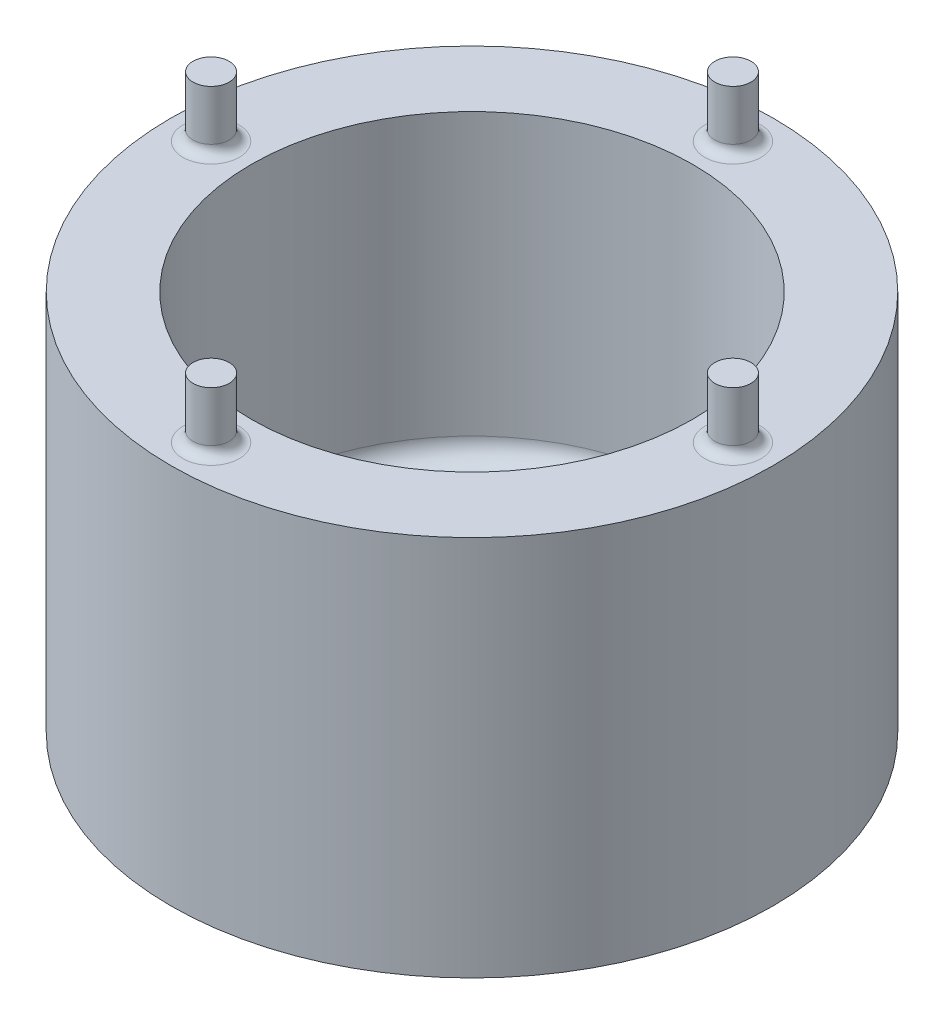
ISO-10303-21;
HEADER;
FILE_DESCRIPTION(('STEP AP214'),'2;1');
FILE_NAME('part.step','',(''),(''),'','','');
FILE_SCHEMA(('AUTOMOTIVE_DESIGN { 1 0 10303 214 1 1 1 1 }'));
ENDSEC;
DATA;
#1=APPLICATION_CONTEXT('core data for automotive mechanical design processes');
#2=APPLICATION_PROTOCOL_DEFINITION('international standard','automotive_design',2000,#1);
#3=PRODUCT_CONTEXT('',#1,'mechanical');
#4=PRODUCT('Part','Part','',(#3));
#5=PRODUCT_RELATED_PRODUCT_CATEGORY('part','',(#4));
#6=PRODUCT_DEFINITION_FORMATION('','',#4);
#7=PRODUCT_DEFINITION_CONTEXT('part definition',#1,'design');
#8=PRODUCT_DEFINITION('design','',#6,#7);
#9=PRODUCT_DEFINITION_SHAPE('','',#8);
#10=(LENGTH_UNIT() NAMED_UNIT(*) SI_UNIT(.MILLI.,.METRE.));
#11=(NAMED_UNIT(*) PLANE_ANGLE_UNIT() SI_UNIT($,.RADIAN.));
#12=(NAMED_UNIT(*) SI_UNIT($,.STERADIAN.) SOLID_ANGLE_UNIT());
#13=UNCERTAINTY_MEASURE_WITH_UNIT(LENGTH_MEASURE(1.E-05),#10,'distance_accuracy_value','');
#14=(GEOMETRIC_REPRESENTATION_CONTEXT(3) GLOBAL_UNCERTAINTY_ASSIGNED_CONTEXT((#13)) GLOBAL_UNIT_ASSIGNED_CONTEXT((#10,
#11,#12)) REPRESENTATION_CONTEXT('',''));
#15=CARTESIAN_POINT('',(0.,0.,0.));
#16=DIRECTION('',(0.,0.,1.));
#17=DIRECTION('',(1.,0.,0.));
#18=AXIS2_PLACEMENT_3D('',#15,#16,#17);
#19=CARTESIAN_POINT('',(0.,4.,0.));
#20=DIRECTION('',(0.,-1.,0.));
#21=DIRECTION('',(0.,0.,-1.));
#22=AXIS2_PLACEMENT_3D('',#19,#20,#21);
#23=CYLINDRICAL_SURFACE('',#22,15.);
#24=CARTESIAN_POINT('',(0.,0.,0.));
#25=DIRECTION('',(0.,1.,0.));
#26=DIRECTION('',(0.,0.,1.));
#27=AXIS2_PLACEMENT_3D('',#24,#25,#26);
#28=CIRCLE('',#27,15.);
#29=CARTESIAN_POINT('',(0.,0.,15.));
#30=VERTEX_POINT('',#29);
#31=EDGE_CURVE('E69',#30,#30,#28,.T.);
#32=ORIENTED_EDGE('',*,*,#31,.T.);
#33=EDGE_LOOP('',(#32));
#34=FACE_BOUND('',#33,.T.);
#35=CARTESIAN_POINT('',(0.,19.,0.));
#36=DIRECTION('',(0.,1.,0.));
#37=DIRECTION('',(0.,0.,1.));
#38=AXIS2_PLACEMENT_3D('',#35,#36,#37);
#39=CIRCLE('',#38,15.);
#40=CARTESIAN_POINT('',(0.,19.,15.));
#41=VERTEX_POINT('',#40);
#42=EDGE_CURVE('E72',#41,#41,#39,.T.);
#43=ORIENTED_EDGE('',*,*,#42,.F.);
#44=EDGE_LOOP('',(#43));
#45=FACE_BOUND('',#44,.T.);
#46=ADVANCED_FACE('F31',(#34,#45),#23,.T.);
#47=CARTESIAN_POINT('',(0.,0.,0.));
#48=DIRECTION('',(0.,1.,0.));
#49=DIRECTION('',(0.,0.,1.));
#50=AXIS2_PLACEMENT_3D('',#47,#48,#49);
#51=PLANE('',#50);
#52=ORIENTED_EDGE('',*,*,#31,.F.);
#53=EDGE_LOOP('',(#52));
#54=FACE_BOUND('',#53,.T.);
#55=ADVANCED_FACE('F108',(#54),#51,.F.);
#56=CARTESIAN_POINT('',(0.,19.,0.));
#57=DIRECTION('',(0.,1.,0.));
#58=DIRECTION('',(0.,0.,1.));
#59=AXIS2_PLACEMENT_3D('',#56,#57,#58);
#60=PLANE('',#59);
#61=CARTESIAN_POINT('',(-13.,19.,1.36167772214882E-13));
#62=DIRECTION('',(0.,1.,0.));
#63=DIRECTION('',(0.,0.,1.));
#64=AXIS2_PLACEMENT_3D('',#61,#62,#63);
#65=CIRCLE('',#64,1.4);
#66=CARTESIAN_POINT('',(-13.,19.,1.40000000000014));
#67=VERTEX_POINT('',#66);
#68=EDGE_CURVE('E42',#67,#67,#65,.F.);
#69=ORIENTED_EDGE('',*,*,#68,.T.);
#70=EDGE_LOOP('',(#69));
#71=FACE_BOUND('',#70,.T.);
#72=CARTESIAN_POINT('',(0.,19.,-13.));
#73=DIRECTION('',(0.,1.,0.));
#74=DIRECTION('',(0.,0.,1.));
#75=AXIS2_PLACEMENT_3D('',#72,#73,#74);
#76=CIRCLE('',#75,1.4);
#77=CARTESIAN_POINT('',(0.,19.,-11.6));
#78=VERTEX_POINT('',#77);
#79=EDGE_CURVE('E51',#78,#78,#76,.F.);
#80=ORIENTED_EDGE('',*,*,#79,.T.);
#81=EDGE_LOOP('',(#80));
#82=FACE_BOUND('',#81,.T.);
#83=CARTESIAN_POINT('',(13.,19.,0.));
#84=DIRECTION('',(0.,1.,0.));
#85=DIRECTION('',(0.,0.,1.));
#86=AXIS2_PLACEMENT_3D('',#83,#84,#85);
#87=CIRCLE('',#86,1.4);
#88=CARTESIAN_POINT('',(13.,19.,1.39999999999995));
#89=VERTEX_POINT('',#88);
#90=EDGE_CURVE('E57',#89,#89,#87,.F.);
#91=ORIENTED_EDGE('',*,*,#90,.T.);
#92=EDGE_LOOP('',(#91));
#93=FACE_BOUND('',#92,.T.);
#94=CARTESIAN_POINT('',(0.,19.,13.));
#95=DIRECTION('',(0.,1.,0.));
#96=DIRECTION('',(0.,0.,1.));
#97=AXIS2_PLACEMENT_3D('',#94,#95,#96);
#98=CIRCLE('',#97,1.4);
#99=CARTESIAN_POINT('',(0.,19.,14.4));
#100=VERTEX_POINT('',#99);
#101=EDGE_CURVE('E63',#100,#100,#98,.F.);
#102=ORIENTED_EDGE('',*,*,#101,.T.);
#103=EDGE_LOOP('',(#102));
#104=FACE_BOUND('',#103,.T.);
#105=ORIENTED_EDGE('',*,*,#42,.T.);
#106=EDGE_LOOP('',(#105));
#107=FACE_BOUND('',#106,.T.);
#108=CARTESIAN_POINT('',(0.,19.,0.));
#109=DIRECTION('',(0.,1.,0.));
#110=DIRECTION('',(0.,0.,1.));
#111=AXIS2_PLACEMENT_3D('',#108,#109,#110);
#112=CIRCLE('',#111,11.);
#113=CARTESIAN_POINT('',(0.,19.,11.));
#114=VERTEX_POINT('',#113);
#115=EDGE_CURVE('E75',#114,#114,#112,.T.);
#116=ORIENTED_EDGE('',*,*,#115,.F.);
#117=EDGE_LOOP('',(#116));
#118=FACE_BOUND('',#117,.T.);
#119=ADVANCED_FACE('F114',(#71,#82,#93,#104,#107,#118),#60,.T.);
#120=CARTESIAN_POINT('',(0.,19.,0.));
#121=DIRECTION('',(0.,-1.,0.));
#122=DIRECTION('',(0.,0.,-1.));
#123=AXIS2_PLACEMENT_3D('',#120,#121,#122);
#124=CYLINDRICAL_SURFACE('',#123,11.);
#125=CARTESIAN_POINT('',(0.,5.,0.));
#126=DIRECTION('',(0.,1.,0.));
#127=DIRECTION('',(0.,0.,1.));
#128=AXIS2_PLACEMENT_3D('',#125,#126,#127);
#129=CIRCLE('',#128,11.);
#130=CARTESIAN_POINT('',(0.,5.,11.));
#131=VERTEX_POINT('',#130);
#132=EDGE_CURVE('E38',#131,#131,#129,.F.);
#133=ORIENTED_EDGE('',*,*,#132,.T.);
#134=EDGE_LOOP('',(#133));
#135=FACE_BOUND('',#134,.T.);
#136=ORIENTED_EDGE('',*,*,#115,.T.);
#137=EDGE_LOOP('',(#136));
#138=FACE_BOUND('',#137,.T.);
#139=ADVANCED_FACE('F145',(#135,#138),#124,.F.);
#140=CARTESIAN_POINT('',(0.,4.,0.));
#141=DIRECTION('',(0.,1.,0.));
#142=DIRECTION('',(0.,0.,1.));
#143=AXIS2_PLACEMENT_3D('',#140,#141,#142);
#144=PLANE('',#143);
#145=CARTESIAN_POINT('',(0.,4.,0.));
#146=DIRECTION('',(0.,1.,0.));
#147=DIRECTION('',(0.,0.,1.));
#148=AXIS2_PLACEMENT_3D('',#145,#146,#147);
#149=CIRCLE('',#148,10.);
#150=CARTESIAN_POINT('',(0.,4.,10.));
#151=VERTEX_POINT('',#150);
#152=EDGE_CURVE('E10',#151,#151,#149,.T.);
#153=ORIENTED_EDGE('',*,*,#152,.T.);
#154=EDGE_LOOP('',(#153));
#155=FACE_BOUND('',#154,.T.);
#156=ADVANCED_FACE('F158',(#155),#144,.T.);
#157=CARTESIAN_POINT('',(0.,22.,13.));
#158=DIRECTION('',(0.,-1.,0.));
#159=DIRECTION('',(0.,0.,-1.));
#160=AXIS2_PLACEMENT_3D('',#157,#158,#159);
#161=CYLINDRICAL_SURFACE('',#160,0.9);
#162=CARTESIAN_POINT('',(0.,19.5,13.));
#163=DIRECTION('',(0.,1.,0.));
#164=DIRECTION('',(0.,0.,1.));
#165=AXIS2_PLACEMENT_3D('',#162,#163,#164);
#166=CIRCLE('',#165,0.9);
#167=CARTESIAN_POINT('',(0.,19.5,13.9));
#168=VERTEX_POINT('',#167);
#169=EDGE_CURVE('E66',#168,#168,#166,.T.);
#170=ORIENTED_EDGE('',*,*,#169,.T.);
#171=EDGE_LOOP('',(#170));
#172=FACE_BOUND('',#171,.T.);
#173=CARTESIAN_POINT('',(0.,22.,13.));
#174=DIRECTION('',(0.,1.,0.));
#175=DIRECTION('',(0.,0.,1.));
#176=AXIS2_PLACEMENT_3D('',#173,#174,#175);
#177=CIRCLE('',#176,0.9);
#178=CARTESIAN_POINT('',(0.,22.,13.9));
#179=VERTEX_POINT('',#178);
#180=EDGE_CURVE('E78',#179,#179,#177,.T.);
#181=ORIENTED_EDGE('',*,*,#180,.F.);
#182=EDGE_LOOP('',(#181));
#183=FACE_BOUND('',#182,.T.);
#184=ADVANCED_FACE('F163',(#172,#183),#161,.T.);
#185=CARTESIAN_POINT('',(0.,22.,13.));
#186=DIRECTION('',(0.,1.,0.));
#187=DIRECTION('',(0.,0.,1.));
#188=AXIS2_PLACEMENT_3D('',#185,#186,#187);
#189=PLANE('',#188);
#190=ORIENTED_EDGE('',*,*,#180,.T.);
#191=EDGE_LOOP('',(#190));
#192=FACE_BOUND('',#191,.T.);
#193=ADVANCED_FACE('F124',(#192),#189,.T.);
#194=CARTESIAN_POINT('',(0.,19.5,13.));
#195=DIRECTION('',(0.,1.,0.));
#196=DIRECTION('',(0.,0.,1.));
#197=AXIS2_PLACEMENT_3D('',#194,#195,#196);
#198=TOROIDAL_SURFACE('',#197,1.4,0.5);
#199=ORIENTED_EDGE('',*,*,#101,.F.);
#200=EDGE_LOOP('',(#199));
#201=FACE_BOUND('',#200,.T.);
#202=ORIENTED_EDGE('',*,*,#169,.F.);
#203=EDGE_LOOP('',(#202));
#204=FACE_BOUND('',#203,.T.);
#205=ADVANCED_FACE('F120',(#201,#204),#198,.F.);
#206=CARTESIAN_POINT('',(13.,22.,0.));
#207=DIRECTION('',(0.,-1.,0.));
#208=DIRECTION('',(0.,0.,-1.));
#209=AXIS2_PLACEMENT_3D('',#206,#207,#208);
#210=CYLINDRICAL_SURFACE('',#209,0.9);
#211=CARTESIAN_POINT('',(13.,19.5,0.));
#212=DIRECTION('',(0.,1.,0.));
#213=DIRECTION('',(0.,0.,1.));
#214=AXIS2_PLACEMENT_3D('',#211,#212,#213);
#215=CIRCLE('',#214,0.9);
#216=CARTESIAN_POINT('',(13.,19.5,0.899999999999954));
#217=VERTEX_POINT('',#216);
#218=EDGE_CURVE('E60',#217,#217,#215,.T.);
#219=ORIENTED_EDGE('',*,*,#218,.T.);
#220=EDGE_LOOP('',(#219));
#221=FACE_BOUND('',#220,.T.);
#222=CARTESIAN_POINT('',(13.,22.,0.));
#223=DIRECTION('',(0.,1.,0.));
#224=DIRECTION('',(1.,0.,0.));
#225=AXIS2_PLACEMENT_3D('',#222,#223,#224);
#226=CIRCLE('',#225,0.9);
#227=CARTESIAN_POINT('',(13.9,22.,0.));
#228=VERTEX_POINT('',#227);
#229=EDGE_CURVE('E81',#228,#228,#226,.T.);
#230=ORIENTED_EDGE('',*,*,#229,.F.);
#231=EDGE_LOOP('',(#230));
#232=FACE_BOUND('',#231,.T.);
#233=ADVANCED_FACE('F123',(#221,#232),#210,.T.);
#234=CARTESIAN_POINT('',(13.,22.,0.));
#235=DIRECTION('',(0.,1.,0.));
#236=DIRECTION('',(1.,0.,0.));
#237=AXIS2_PLACEMENT_3D('',#234,#235,#236);
#238=PLANE('',#237);
#239=ORIENTED_EDGE('',*,*,#229,.T.);
#240=EDGE_LOOP('',(#239));
#241=FACE_BOUND('',#240,.T.);
#242=ADVANCED_FACE('F173',(#241),#238,.T.);
#243=CARTESIAN_POINT('',(0.,22.,-13.));
#244=DIRECTION('',(0.,-1.,0.));
#245=DIRECTION('',(0.,0.,-1.));
#246=AXIS2_PLACEMENT_3D('',#243,#244,#245);
#247=CYLINDRICAL_SURFACE('',#246,0.9);
#248=CARTESIAN_POINT('',(0.,19.5,-13.));
#249=DIRECTION('',(0.,1.,0.));
#250=DIRECTION('',(0.,0.,1.));
#251=AXIS2_PLACEMENT_3D('',#248,#249,#250);
#252=CIRCLE('',#251,0.9);
#253=CARTESIAN_POINT('',(0.,19.5,-12.1));
#254=VERTEX_POINT('',#253);
#255=EDGE_CURVE('E54',#254,#254,#252,.T.);
#256=ORIENTED_EDGE('',*,*,#255,.T.);
#257=EDGE_LOOP('',(#256));
#258=FACE_BOUND('',#257,.T.);
#259=CARTESIAN_POINT('',(0.,22.,-13.));
#260=DIRECTION('',(0.,1.,0.));
#261=DIRECTION('',(0.,0.,-1.));
#262=AXIS2_PLACEMENT_3D('',#259,#260,#261);
#263=CIRCLE('',#262,0.9);
#264=CARTESIAN_POINT('',(0.,22.,-13.9));
#265=VERTEX_POINT('',#264);
#266=EDGE_CURVE('E84',#265,#265,#263,.T.);
#267=ORIENTED_EDGE('',*,*,#266,.F.);
#268=EDGE_LOOP('',(#267));
#269=FACE_BOUND('',#268,.T.);
#270=ADVANCED_FACE('F104',(#258,#269),#247,.T.);
#271=CARTESIAN_POINT('',(0.,22.,-13.));
#272=DIRECTION('',(0.,1.,0.));
#273=DIRECTION('',(0.,0.,-1.));
#274=AXIS2_PLACEMENT_3D('',#271,#272,#273);
#275=PLANE('',#274);
#276=ORIENTED_EDGE('',*,*,#266,.T.);
#277=EDGE_LOOP('',(#276));
#278=FACE_BOUND('',#277,.T.);
#279=ADVANCED_FACE('F95',(#278),#275,.T.);
#280=CARTESIAN_POINT('',(-13.,22.,1.36167772214882E-13));
#281=DIRECTION('',(0.,-1.,0.));
#282=DIRECTION('',(0.,0.,-1.));
#283=AXIS2_PLACEMENT_3D('',#280,#281,#282);
#284=CYLINDRICAL_SURFACE('',#283,0.9);
#285=CARTESIAN_POINT('',(-13.,19.5,1.36167772214882E-13));
#286=DIRECTION('',(0.,1.,0.));
#287=DIRECTION('',(0.,0.,1.));
#288=AXIS2_PLACEMENT_3D('',#285,#286,#287);
#289=CIRCLE('',#288,0.9);
#290=CARTESIAN_POINT('',(-13.,19.5,0.900000000000136));
#291=VERTEX_POINT('',#290);
#292=EDGE_CURVE('E46',#291,#291,#289,.T.);
#293=ORIENTED_EDGE('',*,*,#292,.T.);
#294=EDGE_LOOP('',(#293));
#295=FACE_BOUND('',#294,.T.);
#296=CARTESIAN_POINT('',(-13.,22.,1.36167772214882E-13));
#297=DIRECTION('',(0.,1.,0.));
#298=DIRECTION('',(-1.,0.,0.));
#299=AXIS2_PLACEMENT_3D('',#296,#297,#298);
#300=CIRCLE('',#299,0.9);
#301=CARTESIAN_POINT('',(-13.9,22.,1.45594771829759E-13));
#302=VERTEX_POINT('',#301);
#303=EDGE_CURVE('E87',#302,#302,#300,.T.);
#304=ORIENTED_EDGE('',*,*,#303,.F.);
#305=EDGE_LOOP('',(#304));
#306=FACE_BOUND('',#305,.T.);
#307=ADVANCED_FACE('F93',(#295,#306),#284,.T.);
#308=CARTESIAN_POINT('',(-13.,22.,1.36167772214882E-13));
#309=DIRECTION('',(0.,1.,0.));
#310=DIRECTION('',(-1.,0.,0.));
#311=AXIS2_PLACEMENT_3D('',#308,#309,#310);
#312=PLANE('',#311);
#313=ORIENTED_EDGE('',*,*,#303,.T.);
#314=EDGE_LOOP('',(#313));
#315=FACE_BOUND('',#314,.T.);
#316=ADVANCED_FACE('F91',(#315),#312,.T.);
#317=CARTESIAN_POINT('',(13.,19.5,0.));
#318=DIRECTION('',(0.,1.,0.));
#319=DIRECTION('',(0.,0.,1.));
#320=AXIS2_PLACEMENT_3D('',#317,#318,#319);
#321=TOROIDAL_SURFACE('',#320,1.4,0.5);
#322=ORIENTED_EDGE('',*,*,#90,.F.);
#323=EDGE_LOOP('',(#322));
#324=FACE_BOUND('',#323,.T.);
#325=ORIENTED_EDGE('',*,*,#218,.F.);
#326=EDGE_LOOP('',(#325));
#327=FACE_BOUND('',#326,.T.);
#328=ADVANCED_FACE('F102',(#324,#327),#321,.F.);
#329=CARTESIAN_POINT('',(0.,19.5,-13.));
#330=DIRECTION('',(0.,1.,0.));
#331=DIRECTION('',(0.,0.,1.));
#332=AXIS2_PLACEMENT_3D('',#329,#330,#331);
#333=TOROIDAL_SURFACE('',#332,1.4,0.5);
#334=ORIENTED_EDGE('',*,*,#79,.F.);
#335=EDGE_LOOP('',(#334));
#336=FACE_BOUND('',#335,.T.);
#337=ORIENTED_EDGE('',*,*,#255,.F.);
#338=EDGE_LOOP('',(#337));
#339=FACE_BOUND('',#338,.T.);
#340=ADVANCED_FACE('F128',(#336,#339),#333,.F.);
#341=CARTESIAN_POINT('',(-13.,19.5,1.36167772214882E-13));
#342=DIRECTION('',(0.,1.,0.));
#343=DIRECTION('',(0.,0.,1.));
#344=AXIS2_PLACEMENT_3D('',#341,#342,#343);
#345=TOROIDAL_SURFACE('',#344,1.4,0.5);
#346=ORIENTED_EDGE('',*,*,#68,.F.);
#347=EDGE_LOOP('',(#346));
#348=FACE_BOUND('',#347,.T.);
#349=ORIENTED_EDGE('',*,*,#292,.F.);
#350=EDGE_LOOP('',(#349));
#351=FACE_BOUND('',#350,.T.);
#352=ADVANCED_FACE('F131',(#348,#351),#345,.F.);
#353=CARTESIAN_POINT('',(0.,5.,0.));
#354=DIRECTION('',(0.,1.,0.));
#355=DIRECTION('',(0.,0.,1.));
#356=AXIS2_PLACEMENT_3D('',#353,#354,#355);
#357=TOROIDAL_SURFACE('',#356,10.,1.);
#358=ORIENTED_EDGE('',*,*,#152,.F.);
#359=EDGE_LOOP('',(#358));
#360=FACE_BOUND('',#359,.T.);
#361=ORIENTED_EDGE('',*,*,#132,.F.);
#362=EDGE_LOOP('',(#361));
#363=FACE_BOUND('',#362,.T.);
#364=ADVANCED_FACE('F33',(#360,#363),#357,.F.);
#365=CLOSED_SHELL('',(#46,#55,#119,#139,#156,#184,#193,#205,#233,#242,#270,#279,#307,#316,#328,
#340,#352,#364));
#366=MANIFOLD_SOLID_BREP('B2',#365);
#367=ADVANCED_BREP_SHAPE_REPRESENTATION('',(#18,#366),#14);
#368=SHAPE_DEFINITION_REPRESENTATION(#9,#367);
ENDSEC;
END-ISO-10303-21;
